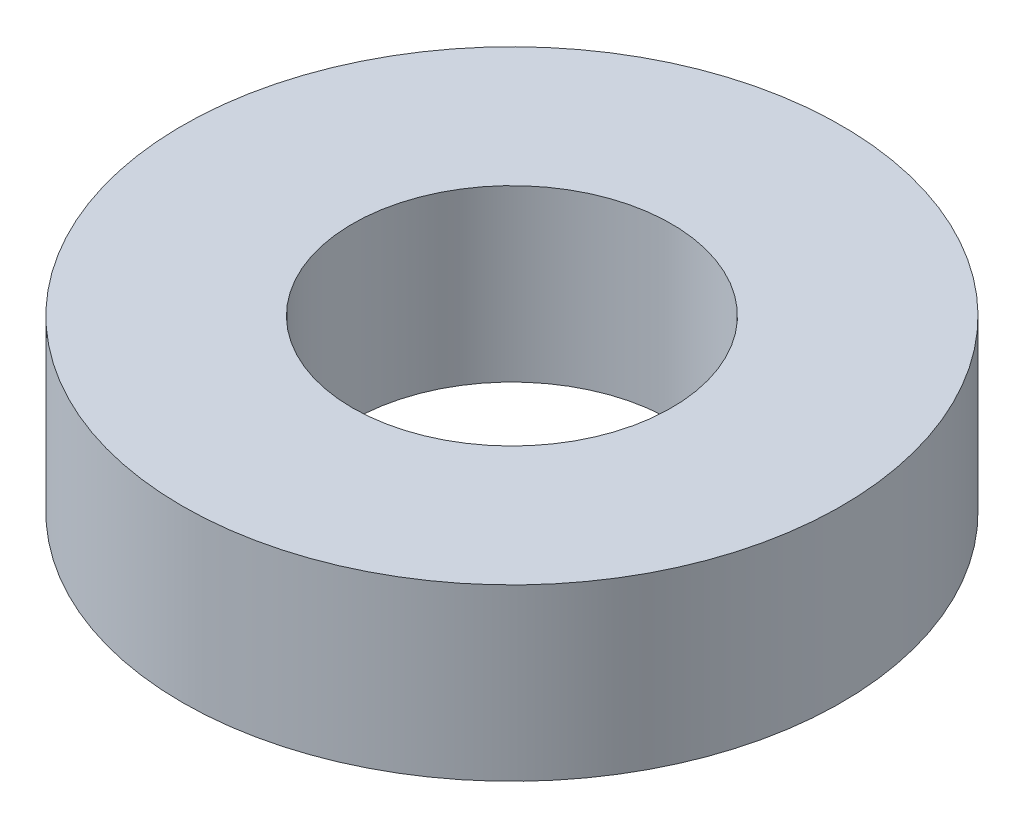
ISO-10303-21;
HEADER;
FILE_DESCRIPTION(('STEP AP214'),'2;1');
FILE_NAME('part.step','',(''),(''),'','','');
FILE_SCHEMA(('AUTOMOTIVE_DESIGN { 1 0 10303 214 1 1 1 1 }'));
ENDSEC;
DATA;
#1=APPLICATION_CONTEXT('core data for automotive mechanical design processes');
#2=APPLICATION_PROTOCOL_DEFINITION('international standard','automotive_design',2000,#1);
#3=PRODUCT_CONTEXT('',#1,'mechanical');
#4=PRODUCT('Part','Part','',(#3));
#5=PRODUCT_RELATED_PRODUCT_CATEGORY('part','',(#4));
#6=PRODUCT_DEFINITION_FORMATION('','',#4);
#7=PRODUCT_DEFINITION_CONTEXT('part definition',#1,'design');
#8=PRODUCT_DEFINITION('design','',#6,#7);
#9=PRODUCT_DEFINITION_SHAPE('','',#8);
#10=(LENGTH_UNIT() NAMED_UNIT(*) SI_UNIT(.MILLI.,.METRE.));
#11=(NAMED_UNIT(*) PLANE_ANGLE_UNIT() SI_UNIT($,.RADIAN.));
#12=(NAMED_UNIT(*) SI_UNIT($,.STERADIAN.) SOLID_ANGLE_UNIT());
#13=UNCERTAINTY_MEASURE_WITH_UNIT(LENGTH_MEASURE(1.E-05),#10,'distance_accuracy_value','');
#14=(GEOMETRIC_REPRESENTATION_CONTEXT(3) GLOBAL_UNCERTAINTY_ASSIGNED_CONTEXT((#13)) GLOBAL_UNIT_ASSIGNED_CONTEXT((#10,
#11,#12)) REPRESENTATION_CONTEXT('',''));
#15=CARTESIAN_POINT('',(0.,0.,0.));
#16=DIRECTION('',(0.,0.,1.));
#17=DIRECTION('',(1.,0.,0.));
#18=AXIS2_PLACEMENT_3D('',#15,#16,#17);
#19=CARTESIAN_POINT('',(0.,16.,0.));
#20=DIRECTION('',(0.,1.,0.));
#21=DIRECTION('',(0.,0.,1.));
#22=AXIS2_PLACEMENT_3D('',#19,#20,#21);
#23=PLANE('',#22);
#24=CARTESIAN_POINT('',(0.,16.,0.));
#25=DIRECTION('',(0.,1.,0.));
#26=DIRECTION('',(0.,0.,1.));
#27=AXIS2_PLACEMENT_3D('',#24,#25,#26);
#28=CIRCLE('',#27,31.);
#29=CARTESIAN_POINT('',(0.,16.,31.));
#30=VERTEX_POINT('',#29);
#31=EDGE_CURVE('E10',#30,#30,#28,.T.);
#32=ORIENTED_EDGE('',*,*,#31,.T.);
#33=EDGE_LOOP('',(#32));
#34=FACE_BOUND('',#33,.T.);
#35=CARTESIAN_POINT('',(0.,16.,0.));
#36=DIRECTION('',(0.,1.,0.));
#37=DIRECTION('',(0.,0.,1.));
#38=AXIS2_PLACEMENT_3D('',#35,#36,#37);
#39=CIRCLE('',#38,15.);
#40=CARTESIAN_POINT('',(0.,16.,15.));
#41=VERTEX_POINT('',#40);
#42=EDGE_CURVE('E50',#41,#41,#39,.T.);
#43=ORIENTED_EDGE('',*,*,#42,.F.);
#44=EDGE_LOOP('',(#43));
#45=FACE_BOUND('',#44,.T.);
#46=ADVANCED_FACE('F37',(#34,#45),#23,.T.);
#47=CARTESIAN_POINT('',(0.,0.,0.));
#48=DIRECTION('',(0.,1.,0.));
#49=DIRECTION('',(0.,0.,1.));
#50=AXIS2_PLACEMENT_3D('',#47,#48,#49);
#51=PLANE('',#50);
#52=CARTESIAN_POINT('',(0.,0.,0.));
#53=DIRECTION('',(0.,1.,0.));
#54=DIRECTION('',(0.,0.,1.));
#55=AXIS2_PLACEMENT_3D('',#52,#53,#54);
#56=CIRCLE('',#55,31.);
#57=CARTESIAN_POINT('',(0.,0.,31.));
#58=VERTEX_POINT('',#57);
#59=EDGE_CURVE('E41',#58,#58,#56,.T.);
#60=ORIENTED_EDGE('',*,*,#59,.F.);
#61=EDGE_LOOP('',(#60));
#62=FACE_BOUND('',#61,.T.);
#63=CARTESIAN_POINT('',(0.,0.,0.));
#64=DIRECTION('',(0.,1.,0.));
#65=DIRECTION('',(0.,0.,1.));
#66=AXIS2_PLACEMENT_3D('',#63,#64,#65);
#67=CIRCLE('',#66,15.);
#68=CARTESIAN_POINT('',(0.,0.,15.));
#69=VERTEX_POINT('',#68);
#70=EDGE_CURVE('E52',#69,#69,#67,.T.);
#71=ORIENTED_EDGE('',*,*,#70,.T.);
#72=EDGE_LOOP('',(#71));
#73=FACE_BOUND('',#72,.T.);
#74=ADVANCED_FACE('F64',(#62,#73),#51,.F.);
#75=CARTESIAN_POINT('',(0.,16.,0.));
#76=DIRECTION('',(0.,-1.,0.));
#77=DIRECTION('',(0.,0.,-1.));
#78=AXIS2_PLACEMENT_3D('',#75,#76,#77);
#79=CYLINDRICAL_SURFACE('',#78,31.);
#80=ORIENTED_EDGE('',*,*,#31,.F.);
#81=EDGE_LOOP('',(#80));
#82=FACE_BOUND('',#81,.T.);
#83=ORIENTED_EDGE('',*,*,#59,.T.);
#84=EDGE_LOOP('',(#83));
#85=FACE_BOUND('',#84,.T.);
#86=ADVANCED_FACE('F39',(#82,#85),#79,.T.);
#87=CARTESIAN_POINT('',(0.,16.,0.));
#88=DIRECTION('',(0.,-1.,0.));
#89=DIRECTION('',(0.,0.,-1.));
#90=AXIS2_PLACEMENT_3D('',#87,#88,#89);
#91=CYLINDRICAL_SURFACE('',#90,15.);
#92=ORIENTED_EDGE('',*,*,#42,.T.);
#93=EDGE_LOOP('',(#92));
#94=FACE_BOUND('',#93,.T.);
#95=ORIENTED_EDGE('',*,*,#70,.F.);
#96=EDGE_LOOP('',(#95));
#97=FACE_BOUND('',#96,.T.);
#98=ADVANCED_FACE('F60',(#94,#97),#91,.F.);
#99=CLOSED_SHELL('',(#46,#74,#86,#98));
#100=MANIFOLD_SOLID_BREP('B2',#99);
#101=ADVANCED_BREP_SHAPE_REPRESENTATION('',(#18,#100),#14);
#102=SHAPE_DEFINITION_REPRESENTATION(#9,#101);
ENDSEC;
END-ISO-10303-21;
